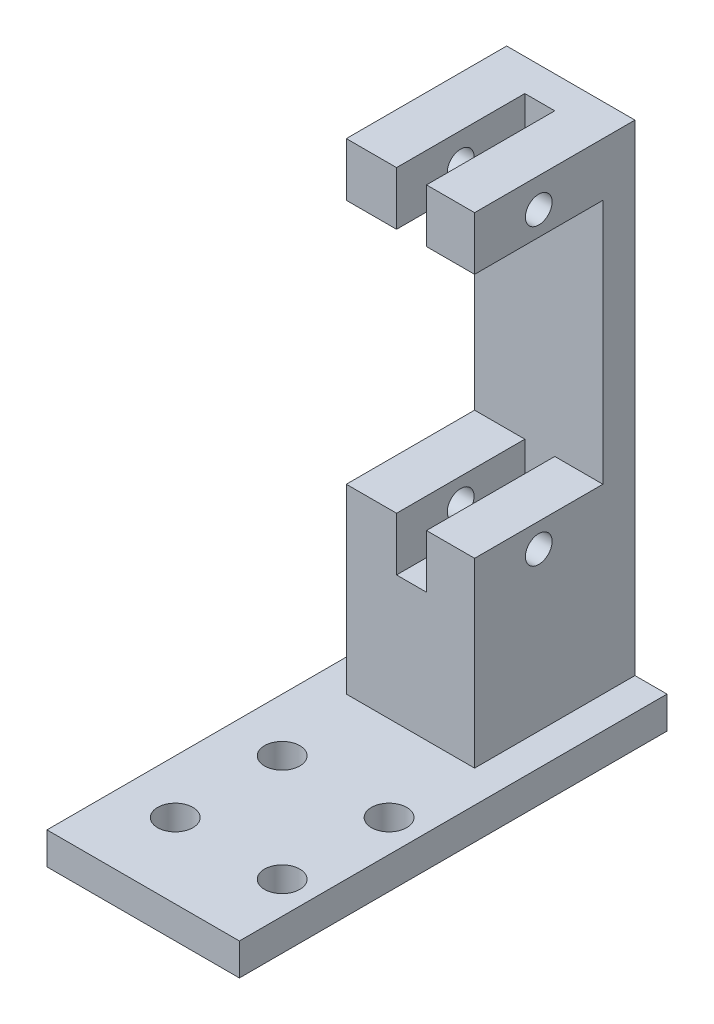
ISO-10303-21;
HEADER;
FILE_DESCRIPTION(('STEP AP214'),'2;1');
FILE_NAME('part.step','',(''),(''),'','','');
FILE_SCHEMA(('AUTOMOTIVE_DESIGN { 1 0 10303 214 1 1 1 1 }'));
ENDSEC;
DATA;
#1=APPLICATION_CONTEXT('core data for automotive mechanical design processes');
#2=APPLICATION_PROTOCOL_DEFINITION('international standard','automotive_design',2000,#1);
#3=PRODUCT_CONTEXT('',#1,'mechanical');
#4=PRODUCT('Part','Part','',(#3));
#5=PRODUCT_RELATED_PRODUCT_CATEGORY('part','',(#4));
#6=PRODUCT_DEFINITION_FORMATION('','',#4);
#7=PRODUCT_DEFINITION_CONTEXT('part definition',#1,'design');
#8=PRODUCT_DEFINITION('design','',#6,#7);
#9=PRODUCT_DEFINITION_SHAPE('','',#8);
#10=(LENGTH_UNIT() NAMED_UNIT(*) SI_UNIT(.MILLI.,.METRE.));
#11=(NAMED_UNIT(*) PLANE_ANGLE_UNIT() SI_UNIT($,.RADIAN.));
#12=(NAMED_UNIT(*) SI_UNIT($,.STERADIAN.) SOLID_ANGLE_UNIT());
#13=UNCERTAINTY_MEASURE_WITH_UNIT(LENGTH_MEASURE(1.E-05),#10,'distance_accuracy_value','');
#14=(GEOMETRIC_REPRESENTATION_CONTEXT(3) GLOBAL_UNCERTAINTY_ASSIGNED_CONTEXT((#13)) GLOBAL_UNIT_ASSIGNED_CONTEXT((#10,
#11,#12)) REPRESENTATION_CONTEXT('',''));
#15=CARTESIAN_POINT('',(0.,0.,0.));
#16=DIRECTION('',(0.,0.,1.));
#17=DIRECTION('',(1.,0.,0.));
#18=AXIS2_PLACEMENT_3D('',#15,#16,#17);
#19=CARTESIAN_POINT('',(-6.00000000000001,20.,3.));
#20=DIRECTION('',(1.,0.,0.));
#21=DIRECTION('',(0.,1.,0.));
#22=AXIS2_PLACEMENT_3D('',#19,#20,#21);
#23=PLANE('',#22);
#24=CARTESIAN_POINT('',(-6.,-10.25,9.));
#25=DIRECTION('',(1.,0.,0.));
#26=DIRECTION('',(0.,1.,0.));
#27=AXIS2_PLACEMENT_3D('',#24,#25,#26);
#28=CIRCLE('',#27,1.25);
#29=CARTESIAN_POINT('',(-6.,-9.00000000000001,9.));
#30=VERTEX_POINT('',#29);
#31=EDGE_CURVE('E255',#30,#30,#28,.T.);
#32=ORIENTED_EDGE('',*,*,#31,.T.);
#33=EDGE_LOOP('',(#32));
#34=FACE_BOUND('',#33,.T.);
#35=CARTESIAN_POINT('',(-6.,17.25,9.));
#36=DIRECTION('',(1.,0.,0.));
#37=DIRECTION('',(0.,1.,0.));
#38=AXIS2_PLACEMENT_3D('',#35,#36,#37);
#39=CIRCLE('',#38,1.25);
#40=CARTESIAN_POINT('',(-6.,18.5,9.));
#41=VERTEX_POINT('',#40);
#42=EDGE_CURVE('E248',#41,#41,#39,.T.);
#43=ORIENTED_EDGE('',*,*,#42,.T.);
#44=EDGE_LOOP('',(#43));
#45=FACE_BOUND('',#44,.T.);
#46=DIRECTION('',(0.,0.,-1.));
#47=VECTOR('',#46,1.);
#48=CARTESIAN_POINT('',(-6.,-25.,40.));
#49=LINE('',#48,#47);
#50=CARTESIAN_POINT('',(-6.00000000000001,-25.,15.));
#51=VERTEX_POINT('',#50);
#52=CARTESIAN_POINT('',(-6.,-25.,0.));
#53=VERTEX_POINT('',#52);
#54=EDGE_CURVE('E11',#51,#53,#49,.T.);
#55=ORIENTED_EDGE('',*,*,#54,.F.);
#56=DIRECTION('',(0.,-1.,0.));
#57=VECTOR('',#56,1.);
#58=CARTESIAN_POINT('',(-6.00000000000001,-8.00000000000001,15.));
#59=LINE('',#58,#57);
#60=CARTESIAN_POINT('',(-6.00000000000001,-8.00000000000001,15.));
#61=VERTEX_POINT('',#60);
#62=EDGE_CURVE('E273',#61,#51,#59,.T.);
#63=ORIENTED_EDGE('',*,*,#62,.F.);
#64=DIRECTION('',(0.,0.,-1.));
#65=VECTOR('',#64,1.);
#66=CARTESIAN_POINT('',(-6.00000000000001,-8.00000000000001,15.));
#67=LINE('',#66,#65);
#68=CARTESIAN_POINT('',(-6.,-8.00000000000001,3.));
#69=VERTEX_POINT('',#68);
#70=EDGE_CURVE('E304',#61,#69,#67,.T.);
#71=ORIENTED_EDGE('',*,*,#70,.T.);
#72=DIRECTION('',(0.,-1.,0.));
#73=VECTOR('',#72,1.);
#74=CARTESIAN_POINT('',(-6.00000000000001,20.,3.));
#75=LINE('',#74,#73);
#76=CARTESIAN_POINT('',(-6.00000000000001,15.,3.));
#77=VERTEX_POINT('',#76);
#78=EDGE_CURVE('E365',#77,#69,#75,.T.);
#79=ORIENTED_EDGE('',*,*,#78,.F.);
#80=DIRECTION('',(0.,0.,-1.));
#81=VECTOR('',#80,1.);
#82=CARTESIAN_POINT('',(-6.00000000000001,15.,15.));
#83=LINE('',#82,#81);
#84=CARTESIAN_POINT('',(-6.00000000000001,15.,15.));
#85=VERTEX_POINT('',#84);
#86=EDGE_CURVE('E331',#85,#77,#83,.T.);
#87=ORIENTED_EDGE('',*,*,#86,.F.);
#88=DIRECTION('',(0.,-1.,0.));
#89=VECTOR('',#88,1.);
#90=CARTESIAN_POINT('',(-6.00000000000001,20.,15.));
#91=LINE('',#90,#89);
#92=CARTESIAN_POINT('',(-6.00000000000001,20.,15.));
#93=VERTEX_POINT('',#92);
#94=EDGE_CURVE('E310',#93,#85,#91,.T.);
#95=ORIENTED_EDGE('',*,*,#94,.F.);
#96=DIRECTION('',(0.,0.,-1.));
#97=VECTOR('',#96,1.);
#98=CARTESIAN_POINT('',(-6.00000000000001,20.,3.));
#99=LINE('',#98,#97);
#100=CARTESIAN_POINT('',(-6.00000000000001,20.,0.));
#101=VERTEX_POINT('',#100);
#102=EDGE_CURVE('E367',#93,#101,#99,.T.);
#103=ORIENTED_EDGE('',*,*,#102,.T.);
#104=DIRECTION('',(0.,-1.,0.));
#105=VECTOR('',#104,1.);
#106=CARTESIAN_POINT('',(-6.00000000000001,20.,0.));
#107=LINE('',#106,#105);
#108=EDGE_CURVE('E363',#101,#53,#107,.T.);
#109=ORIENTED_EDGE('',*,*,#108,.T.);
#110=EDGE_LOOP('',(#55,#63,#71,#79,#87,#95,#103,#109));
#111=FACE_BOUND('',#110,.T.);
#112=ADVANCED_FACE('F36',(#34,#45,#111),#23,.F.);
#113=CARTESIAN_POINT('',(0.,0.,15.));
#114=DIRECTION('',(0.,0.,-1.));
#115=DIRECTION('',(-1.,0.,0.));
#116=AXIS2_PLACEMENT_3D('',#113,#114,#115);
#117=PLANE('',#116);
#118=DIRECTION('',(-1.,0.,0.));
#119=VECTOR('',#118,1.);
#120=CARTESIAN_POINT('',(-6.00000000000001,-25.,15.));
#121=LINE('',#120,#119);
#122=CARTESIAN_POINT('',(6.,-25.,15.));
#123=VERTEX_POINT('',#122);
#124=EDGE_CURVE('E243',#123,#51,#121,.T.);
#125=ORIENTED_EDGE('',*,*,#124,.F.);
#126=DIRECTION('',(0.,1.,0.));
#127=VECTOR('',#126,1.);
#128=CARTESIAN_POINT('',(5.99999999999999,-8.,15.));
#129=LINE('',#128,#127);
#130=CARTESIAN_POINT('',(5.99999999999999,-8.,15.));
#131=VERTEX_POINT('',#130);
#132=EDGE_CURVE('E276',#123,#131,#129,.T.);
#133=ORIENTED_EDGE('',*,*,#132,.T.);
#134=DIRECTION('',(-1.,0.,0.));
#135=VECTOR('',#134,1.);
#136=CARTESIAN_POINT('',(5.99999999999999,-8.,15.));
#137=LINE('',#136,#135);
#138=CARTESIAN_POINT('',(1.5,-8.00000000000001,15.));
#139=VERTEX_POINT('',#138);
#140=EDGE_CURVE('E278',#131,#139,#137,.T.);
#141=ORIENTED_EDGE('',*,*,#140,.T.);
#142=DIRECTION('',(0.,-1.,0.));
#143=VECTOR('',#142,1.);
#144=CARTESIAN_POINT('',(1.5,-13.,15.));
#145=LINE('',#144,#143);
#146=CARTESIAN_POINT('',(1.5,-13.,15.));
#147=VERTEX_POINT('',#146);
#148=EDGE_CURVE('E280',#139,#147,#145,.T.);
#149=ORIENTED_EDGE('',*,*,#148,.T.);
#150=DIRECTION('',(-1.,0.,0.));
#151=VECTOR('',#150,1.);
#152=CARTESIAN_POINT('',(-1.3,-13.,15.));
#153=LINE('',#152,#151);
#154=CARTESIAN_POINT('',(-1.3,-13.,15.));
#155=VERTEX_POINT('',#154);
#156=EDGE_CURVE('E282',#147,#155,#153,.T.);
#157=ORIENTED_EDGE('',*,*,#156,.T.);
#158=DIRECTION('',(0.,1.,0.));
#159=VECTOR('',#158,1.);
#160=CARTESIAN_POINT('',(-1.3,-13.,15.));
#161=LINE('',#160,#159);
#162=CARTESIAN_POINT('',(-1.3,-8.00000000000001,15.));
#163=VERTEX_POINT('',#162);
#164=EDGE_CURVE('E267',#155,#163,#161,.T.);
#165=ORIENTED_EDGE('',*,*,#164,.T.);
#166=DIRECTION('',(-1.,0.,0.));
#167=VECTOR('',#166,1.);
#168=CARTESIAN_POINT('',(-6.00000000000001,-8.00000000000001,15.));
#169=LINE('',#168,#167);
#170=EDGE_CURVE('E270',#163,#61,#169,.T.);
#171=ORIENTED_EDGE('',*,*,#170,.T.);
#172=ORIENTED_EDGE('',*,*,#62,.T.);
#173=EDGE_LOOP('',(#125,#133,#141,#149,#157,#165,#171,#172));
#174=FACE_BOUND('',#173,.T.);
#175=ADVANCED_FACE('F398',(#174),#117,.F.);
#176=CARTESIAN_POINT('',(0.,0.,3.));
#177=DIRECTION('',(0.,0.,-1.));
#178=DIRECTION('',(-1.,0.,0.));
#179=AXIS2_PLACEMENT_3D('',#176,#177,#178);
#180=PLANE('',#179);
#181=DIRECTION('',(-1.,0.,0.));
#182=VECTOR('',#181,1.);
#183=CARTESIAN_POINT('',(-6.00000000000001,-8.00000000000001,3.));
#184=LINE('',#183,#182);
#185=CARTESIAN_POINT('',(-1.3,-8.00000000000001,3.));
#186=VERTEX_POINT('',#185);
#187=EDGE_CURVE('E53',#186,#69,#184,.T.);
#188=ORIENTED_EDGE('',*,*,#187,.F.);
#189=DIRECTION('',(0.,1.,0.));
#190=VECTOR('',#189,1.);
#191=CARTESIAN_POINT('',(-1.3,-13.,3.));
#192=LINE('',#191,#190);
#193=CARTESIAN_POINT('',(-1.3,-13.,3.));
#194=VERTEX_POINT('',#193);
#195=EDGE_CURVE('E266',#194,#186,#192,.T.);
#196=ORIENTED_EDGE('',*,*,#195,.F.);
#197=DIRECTION('',(-1.,0.,0.));
#198=VECTOR('',#197,1.);
#199=CARTESIAN_POINT('',(-1.3,-13.,3.));
#200=LINE('',#199,#198);
#201=CARTESIAN_POINT('',(1.5,-13.,3.));
#202=VERTEX_POINT('',#201);
#203=EDGE_CURVE('E271',#202,#194,#200,.T.);
#204=ORIENTED_EDGE('',*,*,#203,.F.);
#205=DIRECTION('',(0.,-1.,0.));
#206=VECTOR('',#205,1.);
#207=CARTESIAN_POINT('',(1.5,-13.,3.));
#208=LINE('',#207,#206);
#209=CARTESIAN_POINT('',(1.5,-8.00000000000001,3.));
#210=VERTEX_POINT('',#209);
#211=EDGE_CURVE('E60',#210,#202,#208,.T.);
#212=ORIENTED_EDGE('',*,*,#211,.F.);
#213=DIRECTION('',(-1.,0.,0.));
#214=VECTOR('',#213,1.);
#215=CARTESIAN_POINT('',(5.99999999999999,-8.,3.));
#216=LINE('',#215,#214);
#217=CARTESIAN_POINT('',(6.,-8.00000000000001,3.));
#218=VERTEX_POINT('',#217);
#219=EDGE_CURVE('E288',#218,#210,#216,.T.);
#220=ORIENTED_EDGE('',*,*,#219,.F.);
#221=DIRECTION('',(0.,-1.,0.));
#222=VECTOR('',#221,1.);
#223=CARTESIAN_POINT('',(5.99999999999999,20.,3.));
#224=LINE('',#223,#222);
#225=CARTESIAN_POINT('',(6.,15.,3.));
#226=VERTEX_POINT('',#225);
#227=EDGE_CURVE('E359',#226,#218,#224,.T.);
#228=ORIENTED_EDGE('',*,*,#227,.F.);
#229=DIRECTION('',(1.,0.,0.));
#230=VECTOR('',#229,1.);
#231=CARTESIAN_POINT('',(1.5,15.,3.));
#232=LINE('',#231,#230);
#233=CARTESIAN_POINT('',(1.5,15.,3.));
#234=VERTEX_POINT('',#233);
#235=EDGE_CURVE('E339',#234,#226,#232,.T.);
#236=ORIENTED_EDGE('',*,*,#235,.F.);
#237=DIRECTION('',(0.,-1.,0.));
#238=VECTOR('',#237,1.);
#239=CARTESIAN_POINT('',(1.5,20.,3.));
#240=LINE('',#239,#238);
#241=CARTESIAN_POINT('',(1.5,20.,3.));
#242=VERTEX_POINT('',#241);
#243=EDGE_CURVE('E334',#242,#234,#240,.T.);
#244=ORIENTED_EDGE('',*,*,#243,.F.);
#245=DIRECTION('',(1.,0.,0.));
#246=VECTOR('',#245,1.);
#247=CARTESIAN_POINT('',(-6.00000000000001,20.,3.));
#248=LINE('',#247,#246);
#249=CARTESIAN_POINT('',(-1.30000000000001,20.,3.));
#250=VERTEX_POINT('',#249);
#251=EDGE_CURVE('E362',#250,#242,#248,.T.);
#252=ORIENTED_EDGE('',*,*,#251,.F.);
#253=DIRECTION('',(0.,1.,0.));
#254=VECTOR('',#253,1.);
#255=CARTESIAN_POINT('',(-1.30000000000001,20.,3.));
#256=LINE('',#255,#254);
#257=CARTESIAN_POINT('',(-1.30000000000001,15.,3.));
#258=VERTEX_POINT('',#257);
#259=EDGE_CURVE('E314',#258,#250,#256,.T.);
#260=ORIENTED_EDGE('',*,*,#259,.F.);
#261=DIRECTION('',(1.,0.,0.));
#262=VECTOR('',#261,1.);
#263=CARTESIAN_POINT('',(-6.00000000000001,15.,3.));
#264=LINE('',#263,#262);
#265=EDGE_CURVE('E309',#77,#258,#264,.T.);
#266=ORIENTED_EDGE('',*,*,#265,.F.);
#267=ORIENTED_EDGE('',*,*,#78,.T.);
#268=EDGE_LOOP('',(#188,#196,#204,#212,#220,#228,#236,#244,#252,#260,#266,#267));
#269=FACE_BOUND('',#268,.T.);
#270=ADVANCED_FACE('F404',(#269),#180,.F.);
#271=CARTESIAN_POINT('',(5.99999999999999,20.,3.));
#272=DIRECTION('',(1.,0.,0.));
#273=DIRECTION('',(0.,1.,0.));
#274=AXIS2_PLACEMENT_3D('',#271,#272,#273);
#275=PLANE('',#274);
#276=DIRECTION('',(0.,0.,1.));
#277=VECTOR('',#276,1.);
#278=CARTESIAN_POINT('',(6.,-25.,40.));
#279=LINE('',#278,#277);
#280=CARTESIAN_POINT('',(6.,-25.,0.));
#281=VERTEX_POINT('',#280);
#282=EDGE_CURVE('E229',#281,#123,#279,.T.);
#283=ORIENTED_EDGE('',*,*,#282,.F.);
#284=DIRECTION('',(0.,-1.,0.));
#285=VECTOR('',#284,1.);
#286=CARTESIAN_POINT('',(5.99999999999999,20.,0.));
#287=LINE('',#286,#285);
#288=CARTESIAN_POINT('',(5.99999999999999,20.,0.));
#289=VERTEX_POINT('',#288);
#290=EDGE_CURVE('E358',#289,#281,#287,.T.);
#291=ORIENTED_EDGE('',*,*,#290,.F.);
#292=DIRECTION('',(0.,0.,-1.));
#293=VECTOR('',#292,1.);
#294=CARTESIAN_POINT('',(5.99999999999999,20.,3.));
#295=LINE('',#294,#293);
#296=CARTESIAN_POINT('',(5.99999999999999,20.,15.));
#297=VERTEX_POINT('',#296);
#298=EDGE_CURVE('E45',#297,#289,#295,.T.);
#299=ORIENTED_EDGE('',*,*,#298,.F.);
#300=DIRECTION('',(0.,1.,0.));
#301=VECTOR('',#300,1.);
#302=CARTESIAN_POINT('',(5.99999999999999,20.,15.));
#303=LINE('',#302,#301);
#304=CARTESIAN_POINT('',(5.99999999999999,15.,15.));
#305=VERTEX_POINT('',#304);
#306=EDGE_CURVE('E335',#305,#297,#303,.T.);
#307=ORIENTED_EDGE('',*,*,#306,.F.);
#308=DIRECTION('',(0.,0.,-1.));
#309=VECTOR('',#308,1.);
#310=CARTESIAN_POINT('',(5.99999999999999,15.,15.));
#311=LINE('',#310,#309);
#312=EDGE_CURVE('E345',#305,#226,#311,.T.);
#313=ORIENTED_EDGE('',*,*,#312,.T.);
#314=ORIENTED_EDGE('',*,*,#227,.T.);
#315=DIRECTION('',(0.,0.,-1.));
#316=VECTOR('',#315,1.);
#317=CARTESIAN_POINT('',(5.99999999999999,-8.,15.));
#318=LINE('',#317,#316);
#319=EDGE_CURVE('E301',#131,#218,#318,.T.);
#320=ORIENTED_EDGE('',*,*,#319,.F.);
#321=ORIENTED_EDGE('',*,*,#132,.F.);
#322=EDGE_LOOP('',(#283,#291,#299,#307,#313,#314,#320,#321));
#323=FACE_BOUND('',#322,.T.);
#324=CARTESIAN_POINT('',(6.,17.25,9.));
#325=DIRECTION('',(1.,0.,0.));
#326=DIRECTION('',(0.,1.,0.));
#327=AXIS2_PLACEMENT_3D('',#324,#325,#326);
#328=CIRCLE('',#327,1.25);
#329=CARTESIAN_POINT('',(6.,18.5,9.));
#330=VERTEX_POINT('',#329);
#331=EDGE_CURVE('E252',#330,#330,#328,.T.);
#332=ORIENTED_EDGE('',*,*,#331,.F.);
#333=EDGE_LOOP('',(#332));
#334=FACE_BOUND('',#333,.T.);
#335=CARTESIAN_POINT('',(6.,-10.25,9.));
#336=DIRECTION('',(1.,0.,0.));
#337=DIRECTION('',(0.,1.,0.));
#338=AXIS2_PLACEMENT_3D('',#335,#336,#337);
#339=CIRCLE('',#338,1.25);
#340=CARTESIAN_POINT('',(6.,-9.00000000000001,9.));
#341=VERTEX_POINT('',#340);
#342=EDGE_CURVE('E247',#341,#341,#339,.T.);
#343=ORIENTED_EDGE('',*,*,#342,.F.);
#344=EDGE_LOOP('',(#343));
#345=FACE_BOUND('',#344,.T.);
#346=ADVANCED_FACE('F38',(#323,#334,#345),#275,.T.);
#347=CARTESIAN_POINT('',(-6.00000000000001,20.,3.));
#348=DIRECTION('',(0.,1.,0.));
#349=DIRECTION('',(0.,0.,1.));
#350=AXIS2_PLACEMENT_3D('',#347,#348,#349);
#351=PLANE('',#350);
#352=DIRECTION('',(1.,0.,0.));
#353=VECTOR('',#352,1.);
#354=CARTESIAN_POINT('',(-6.00000000000001,20.,0.));
#355=LINE('',#354,#353);
#356=EDGE_CURVE('E370',#101,#289,#355,.T.);
#357=ORIENTED_EDGE('',*,*,#356,.F.);
#358=ORIENTED_EDGE('',*,*,#102,.F.);
#359=DIRECTION('',(-1.,0.,0.));
#360=VECTOR('',#359,1.);
#361=CARTESIAN_POINT('',(-6.00000000000001,20.,15.));
#362=LINE('',#361,#360);
#363=CARTESIAN_POINT('',(-1.30000000000001,20.,15.));
#364=VERTEX_POINT('',#363);
#365=EDGE_CURVE('E318',#364,#93,#362,.T.);
#366=ORIENTED_EDGE('',*,*,#365,.F.);
#367=DIRECTION('',(0.,0.,-1.));
#368=VECTOR('',#367,1.);
#369=CARTESIAN_POINT('',(-1.30000000000001,20.,15.));
#370=LINE('',#369,#368);
#371=EDGE_CURVE('E321',#364,#250,#370,.T.);
#372=ORIENTED_EDGE('',*,*,#371,.T.);
#373=ORIENTED_EDGE('',*,*,#251,.T.);
#374=DIRECTION('',(0.,0.,-1.));
#375=VECTOR('',#374,1.);
#376=CARTESIAN_POINT('',(1.5,20.,15.));
#377=LINE('',#376,#375);
#378=CARTESIAN_POINT('',(1.5,20.,15.));
#379=VERTEX_POINT('',#378);
#380=EDGE_CURVE('E355',#379,#242,#377,.T.);
#381=ORIENTED_EDGE('',*,*,#380,.F.);
#382=DIRECTION('',(-1.,0.,0.));
#383=VECTOR('',#382,1.);
#384=CARTESIAN_POINT('',(1.5,20.,15.));
#385=LINE('',#384,#383);
#386=EDGE_CURVE('E338',#297,#379,#385,.T.);
#387=ORIENTED_EDGE('',*,*,#386,.F.);
#388=ORIENTED_EDGE('',*,*,#298,.T.);
#389=EDGE_LOOP('',(#357,#358,#366,#372,#373,#381,#387,#388));
#390=FACE_BOUND('',#389,.T.);
#391=ADVANCED_FACE('F410',(#390),#351,.T.);
#392=CARTESIAN_POINT('',(0.,0.,0.));
#393=DIRECTION('',(0.,0.,-1.));
#394=DIRECTION('',(-1.,0.,0.));
#395=AXIS2_PLACEMENT_3D('',#392,#393,#394);
#396=PLANE('',#395);
#397=ORIENTED_EDGE('',*,*,#290,.T.);
#398=DIRECTION('',(-1.,0.,0.));
#399=VECTOR('',#398,1.);
#400=CARTESIAN_POINT('',(9.,-25.,0.));
#401=LINE('',#400,#399);
#402=CARTESIAN_POINT('',(9.,-25.,0.));
#403=VERTEX_POINT('',#402);
#404=EDGE_CURVE('E240',#403,#281,#401,.T.);
#405=ORIENTED_EDGE('',*,*,#404,.F.);
#406=DIRECTION('',(0.,1.,0.));
#407=VECTOR('',#406,1.);
#408=CARTESIAN_POINT('',(9.,-25.,0.));
#409=LINE('',#408,#407);
#410=CARTESIAN_POINT('',(9.00000000000001,-28.,0.));
#411=VERTEX_POINT('',#410);
#412=EDGE_CURVE('E236',#411,#403,#409,.T.);
#413=ORIENTED_EDGE('',*,*,#412,.F.);
#414=DIRECTION('',(1.,0.,0.));
#415=VECTOR('',#414,1.);
#416=CARTESIAN_POINT('',(-6.,-28.,0.));
#417=LINE('',#416,#415);
#418=CARTESIAN_POINT('',(-9.,-28.,0.));
#419=VERTEX_POINT('',#418);
#420=EDGE_CURVE('E184',#419,#411,#417,.T.);
#421=ORIENTED_EDGE('',*,*,#420,.F.);
#422=DIRECTION('',(0.,-1.,0.));
#423=VECTOR('',#422,1.);
#424=CARTESIAN_POINT('',(-9.,-25.,0.));
#425=LINE('',#424,#423);
#426=CARTESIAN_POINT('',(-9.,-25.,0.));
#427=VERTEX_POINT('',#426);
#428=EDGE_CURVE('E196',#427,#419,#425,.T.);
#429=ORIENTED_EDGE('',*,*,#428,.F.);
#430=DIRECTION('',(1.,0.,0.));
#431=VECTOR('',#430,1.);
#432=CARTESIAN_POINT('',(-9.,-25.,0.));
#433=LINE('',#432,#431);
#434=EDGE_CURVE('E192',#427,#53,#433,.T.);
#435=ORIENTED_EDGE('',*,*,#434,.T.);
#436=ORIENTED_EDGE('',*,*,#108,.F.);
#437=ORIENTED_EDGE('',*,*,#356,.T.);
#438=EDGE_LOOP('',(#397,#405,#413,#421,#429,#435,#436,#437));
#439=FACE_BOUND('',#438,.T.);
#440=ADVANCED_FACE('F408',(#439),#396,.T.);
#441=CARTESIAN_POINT('',(1.5,20.,15.));
#442=DIRECTION('',(1.,0.,0.));
#443=DIRECTION('',(0.,1.,0.));
#444=AXIS2_PLACEMENT_3D('',#441,#442,#443);
#445=PLANE('',#444);
#446=CARTESIAN_POINT('',(1.5,17.25,9.));
#447=DIRECTION('',(1.,0.,0.));
#448=DIRECTION('',(0.,1.,0.));
#449=AXIS2_PLACEMENT_3D('',#446,#447,#448);
#450=CIRCLE('',#449,1.25);
#451=CARTESIAN_POINT('',(1.5,18.5,9.));
#452=VERTEX_POINT('',#451);
#453=EDGE_CURVE('E263',#452,#452,#450,.T.);
#454=ORIENTED_EDGE('',*,*,#453,.T.);
#455=EDGE_LOOP('',(#454));
#456=FACE_BOUND('',#455,.T.);
#457=ORIENTED_EDGE('',*,*,#243,.T.);
#458=DIRECTION('',(0.,0.,-1.));
#459=VECTOR('',#458,1.);
#460=CARTESIAN_POINT('',(1.5,15.,15.));
#461=LINE('',#460,#459);
#462=CARTESIAN_POINT('',(1.5,15.,15.));
#463=VERTEX_POINT('',#462);
#464=EDGE_CURVE('E352',#463,#234,#461,.T.);
#465=ORIENTED_EDGE('',*,*,#464,.F.);
#466=DIRECTION('',(0.,-1.,0.));
#467=VECTOR('',#466,1.);
#468=CARTESIAN_POINT('',(1.5,20.,15.));
#469=LINE('',#468,#467);
#470=EDGE_CURVE('E341',#379,#463,#469,.T.);
#471=ORIENTED_EDGE('',*,*,#470,.F.);
#472=ORIENTED_EDGE('',*,*,#380,.T.);
#473=EDGE_LOOP('',(#457,#465,#471,#472));
#474=FACE_BOUND('',#473,.T.);
#475=ADVANCED_FACE('F417',(#456,#474),#445,.F.);
#476=CARTESIAN_POINT('',(1.5,15.,15.));
#477=DIRECTION('',(0.,1.,0.));
#478=DIRECTION('',(0.,0.,1.));
#479=AXIS2_PLACEMENT_3D('',#476,#477,#478);
#480=PLANE('',#479);
#481=ORIENTED_EDGE('',*,*,#235,.T.);
#482=ORIENTED_EDGE('',*,*,#312,.F.);
#483=DIRECTION('',(1.,0.,0.));
#484=VECTOR('',#483,1.);
#485=CARTESIAN_POINT('',(1.5,15.,15.));
#486=LINE('',#485,#484);
#487=EDGE_CURVE('E343',#463,#305,#486,.T.);
#488=ORIENTED_EDGE('',*,*,#487,.F.);
#489=ORIENTED_EDGE('',*,*,#464,.T.);
#490=EDGE_LOOP('',(#481,#482,#488,#489));
#491=FACE_BOUND('',#490,.T.);
#492=ADVANCED_FACE('F455',(#491),#480,.F.);
#493=CARTESIAN_POINT('',(0.,0.,15.));
#494=DIRECTION('',(0.,0.,1.));
#495=DIRECTION('',(1.,0.,0.));
#496=AXIS2_PLACEMENT_3D('',#493,#494,#495);
#497=PLANE('',#496);
#498=ORIENTED_EDGE('',*,*,#306,.T.);
#499=ORIENTED_EDGE('',*,*,#386,.T.);
#500=ORIENTED_EDGE('',*,*,#470,.T.);
#501=ORIENTED_EDGE('',*,*,#487,.T.);
#502=EDGE_LOOP('',(#498,#499,#500,#501));
#503=FACE_BOUND('',#502,.T.);
#504=ADVANCED_FACE('F484',(#503),#497,.T.);
#505=CARTESIAN_POINT('',(-6.00000000000001,15.,15.));
#506=DIRECTION('',(0.,1.,0.));
#507=DIRECTION('',(-1.,0.,0.));
#508=AXIS2_PLACEMENT_3D('',#505,#506,#507);
#509=PLANE('',#508);
#510=ORIENTED_EDGE('',*,*,#265,.T.);
#511=DIRECTION('',(0.,0.,-1.));
#512=VECTOR('',#511,1.);
#513=CARTESIAN_POINT('',(-1.30000000000001,15.,15.));
#514=LINE('',#513,#512);
#515=CARTESIAN_POINT('',(-1.30000000000001,15.,15.));
#516=VERTEX_POINT('',#515);
#517=EDGE_CURVE('E328',#516,#258,#514,.T.);
#518=ORIENTED_EDGE('',*,*,#517,.F.);
#519=DIRECTION('',(1.,0.,0.));
#520=VECTOR('',#519,1.);
#521=CARTESIAN_POINT('',(-6.00000000000001,15.,15.));
#522=LINE('',#521,#520);
#523=EDGE_CURVE('E313',#85,#516,#522,.T.);
#524=ORIENTED_EDGE('',*,*,#523,.F.);
#525=ORIENTED_EDGE('',*,*,#86,.T.);
#526=EDGE_LOOP('',(#510,#518,#524,#525));
#527=FACE_BOUND('',#526,.T.);
#528=ADVANCED_FACE('F467',(#527),#509,.F.);
#529=CARTESIAN_POINT('',(-1.30000000000001,20.,15.));
#530=DIRECTION('',(-1.,0.,0.));
#531=DIRECTION('',(0.,0.,1.));
#532=AXIS2_PLACEMENT_3D('',#529,#530,#531);
#533=PLANE('',#532);
#534=CARTESIAN_POINT('',(-1.30000000000001,17.25,9.));
#535=DIRECTION('',(-1.,0.,0.));
#536=DIRECTION('',(0.,0.,1.));
#537=AXIS2_PLACEMENT_3D('',#534,#535,#536);
#538=CIRCLE('',#537,1.25);
#539=CARTESIAN_POINT('',(-1.30000000000001,17.25,10.25));
#540=VERTEX_POINT('',#539);
#541=EDGE_CURVE('E40',#540,#540,#538,.T.);
#542=ORIENTED_EDGE('',*,*,#541,.T.);
#543=EDGE_LOOP('',(#542));
#544=FACE_BOUND('',#543,.T.);
#545=ORIENTED_EDGE('',*,*,#259,.T.);
#546=ORIENTED_EDGE('',*,*,#371,.F.);
#547=DIRECTION('',(0.,1.,0.));
#548=VECTOR('',#547,1.);
#549=CARTESIAN_POINT('',(-1.30000000000001,20.,15.));
#550=LINE('',#549,#548);
#551=EDGE_CURVE('E316',#516,#364,#550,.T.);
#552=ORIENTED_EDGE('',*,*,#551,.F.);
#553=ORIENTED_EDGE('',*,*,#517,.T.);
#554=EDGE_LOOP('',(#545,#546,#552,#553));
#555=FACE_BOUND('',#554,.T.);
#556=ADVANCED_FACE('F463',(#544,#555),#533,.F.);
#557=CARTESIAN_POINT('',(0.,0.,15.));
#558=DIRECTION('',(0.,0.,1.));
#559=DIRECTION('',(1.,0.,0.));
#560=AXIS2_PLACEMENT_3D('',#557,#558,#559);
#561=PLANE('',#560);
#562=ORIENTED_EDGE('',*,*,#94,.T.);
#563=ORIENTED_EDGE('',*,*,#523,.T.);
#564=ORIENTED_EDGE('',*,*,#551,.T.);
#565=ORIENTED_EDGE('',*,*,#365,.T.);
#566=EDGE_LOOP('',(#562,#563,#564,#565));
#567=FACE_BOUND('',#566,.T.);
#568=ADVANCED_FACE('F469',(#567),#561,.T.);
#569=CARTESIAN_POINT('',(-1.3,-13.,15.));
#570=DIRECTION('',(-1.,0.,0.));
#571=DIRECTION('',(0.,0.,1.));
#572=AXIS2_PLACEMENT_3D('',#569,#570,#571);
#573=PLANE('',#572);
#574=CARTESIAN_POINT('',(-1.3,-10.25,9.));
#575=DIRECTION('',(-1.,0.,0.));
#576=DIRECTION('',(0.,0.,1.));
#577=AXIS2_PLACEMENT_3D('',#574,#575,#576);
#578=CIRCLE('',#577,1.25);
#579=CARTESIAN_POINT('',(-1.3,-10.25,10.25));
#580=VERTEX_POINT('',#579);
#581=EDGE_CURVE('E260',#580,#580,#578,.T.);
#582=ORIENTED_EDGE('',*,*,#581,.T.);
#583=EDGE_LOOP('',(#582));
#584=FACE_BOUND('',#583,.T.);
#585=ORIENTED_EDGE('',*,*,#195,.T.);
#586=DIRECTION('',(0.,0.,-1.));
#587=VECTOR('',#586,1.);
#588=CARTESIAN_POINT('',(-1.3,-8.00000000000001,15.));
#589=LINE('',#588,#587);
#590=EDGE_CURVE('E307',#163,#186,#589,.T.);
#591=ORIENTED_EDGE('',*,*,#590,.F.);
#592=ORIENTED_EDGE('',*,*,#164,.F.);
#593=DIRECTION('',(0.,0.,-1.));
#594=VECTOR('',#593,1.);
#595=CARTESIAN_POINT('',(-1.3,-13.,15.));
#596=LINE('',#595,#594);
#597=EDGE_CURVE('E284',#155,#194,#596,.T.);
#598=ORIENTED_EDGE('',*,*,#597,.T.);
#599=EDGE_LOOP('',(#585,#591,#592,#598));
#600=FACE_BOUND('',#599,.T.);
#601=ADVANCED_FACE('F440',(#584,#600),#573,.F.);
#602=CARTESIAN_POINT('',(-6.00000000000001,-8.00000000000001,15.));
#603=DIRECTION('',(0.,-1.,0.));
#604=DIRECTION('',(0.,0.,-1.));
#605=AXIS2_PLACEMENT_3D('',#602,#603,#604);
#606=PLANE('',#605);
#607=ORIENTED_EDGE('',*,*,#187,.T.);
#608=ORIENTED_EDGE('',*,*,#70,.F.);
#609=ORIENTED_EDGE('',*,*,#170,.F.);
#610=ORIENTED_EDGE('',*,*,#590,.T.);
#611=EDGE_LOOP('',(#607,#608,#609,#610));
#612=FACE_BOUND('',#611,.T.);
#613=ADVANCED_FACE('F436',(#612),#606,.F.);
#614=CARTESIAN_POINT('',(5.99999999999999,-8.,15.));
#615=DIRECTION('',(0.,-1.,0.));
#616=DIRECTION('',(1.,0.,0.));
#617=AXIS2_PLACEMENT_3D('',#614,#615,#616);
#618=PLANE('',#617);
#619=ORIENTED_EDGE('',*,*,#219,.T.);
#620=DIRECTION('',(0.,0.,-1.));
#621=VECTOR('',#620,1.);
#622=CARTESIAN_POINT('',(1.5,-8.00000000000001,15.));
#623=LINE('',#622,#621);
#624=EDGE_CURVE('E298',#139,#210,#623,.T.);
#625=ORIENTED_EDGE('',*,*,#624,.F.);
#626=ORIENTED_EDGE('',*,*,#140,.F.);
#627=ORIENTED_EDGE('',*,*,#319,.T.);
#628=EDGE_LOOP('',(#619,#625,#626,#627));
#629=FACE_BOUND('',#628,.T.);
#630=ADVANCED_FACE('F448',(#629),#618,.F.);
#631=CARTESIAN_POINT('',(1.5,-13.,15.));
#632=DIRECTION('',(1.,0.,0.));
#633=DIRECTION('',(0.,0.,-1.));
#634=AXIS2_PLACEMENT_3D('',#631,#632,#633);
#635=PLANE('',#634);
#636=CARTESIAN_POINT('',(1.5,-10.25,9.));
#637=DIRECTION('',(1.,0.,0.));
#638=DIRECTION('',(0.,0.,-1.));
#639=AXIS2_PLACEMENT_3D('',#636,#637,#638);
#640=CIRCLE('',#639,1.25);
#641=CARTESIAN_POINT('',(1.5,-10.25,7.75));
#642=VERTEX_POINT('',#641);
#643=EDGE_CURVE('E251',#642,#642,#640,.T.);
#644=ORIENTED_EDGE('',*,*,#643,.T.);
#645=EDGE_LOOP('',(#644));
#646=FACE_BOUND('',#645,.T.);
#647=ORIENTED_EDGE('',*,*,#211,.T.);
#648=DIRECTION('',(0.,0.,-1.));
#649=VECTOR('',#648,1.);
#650=CARTESIAN_POINT('',(1.5,-13.,15.));
#651=LINE('',#650,#649);
#652=EDGE_CURVE('E295',#147,#202,#651,.T.);
#653=ORIENTED_EDGE('',*,*,#652,.F.);
#654=ORIENTED_EDGE('',*,*,#148,.F.);
#655=ORIENTED_EDGE('',*,*,#624,.T.);
#656=EDGE_LOOP('',(#647,#653,#654,#655));
#657=FACE_BOUND('',#656,.T.);
#658=ADVANCED_FACE('F378',(#646,#657),#635,.F.);
#659=CARTESIAN_POINT('',(-1.3,-13.,15.));
#660=DIRECTION('',(0.,-1.,0.));
#661=DIRECTION('',(0.,0.,-1.));
#662=AXIS2_PLACEMENT_3D('',#659,#660,#661);
#663=PLANE('',#662);
#664=ORIENTED_EDGE('',*,*,#203,.T.);
#665=ORIENTED_EDGE('',*,*,#597,.F.);
#666=ORIENTED_EDGE('',*,*,#156,.F.);
#667=ORIENTED_EDGE('',*,*,#652,.T.);
#668=EDGE_LOOP('',(#664,#665,#666,#667));
#669=FACE_BOUND('',#668,.T.);
#670=ADVANCED_FACE('F384',(#669),#663,.F.);
#671=CARTESIAN_POINT('',(-6.,-10.25,9.));
#672=DIRECTION('',(1.,0.,0.));
#673=DIRECTION('',(0.,1.,0.));
#674=AXIS2_PLACEMENT_3D('',#671,#672,#673);
#675=CYLINDRICAL_SURFACE('',#674,1.25);
#676=ORIENTED_EDGE('',*,*,#342,.T.);
#677=EDGE_LOOP('',(#676));
#678=FACE_BOUND('',#677,.T.);
#679=ORIENTED_EDGE('',*,*,#643,.F.);
#680=EDGE_LOOP('',(#679));
#681=FACE_BOUND('',#680,.T.);
#682=ADVANCED_FACE('F381',(#678,#681),#675,.F.);
#683=ORIENTED_EDGE('',*,*,#31,.F.);
#684=EDGE_LOOP('',(#683));
#685=FACE_BOUND('',#684,.T.);
#686=ORIENTED_EDGE('',*,*,#581,.F.);
#687=EDGE_LOOP('',(#686));
#688=FACE_BOUND('',#687,.T.);
#689=ADVANCED_FACE('F383',(#685,#688),#675,.F.);
#690=CARTESIAN_POINT('',(-6.,17.25,9.));
#691=DIRECTION('',(1.,0.,0.));
#692=DIRECTION('',(0.,1.,0.));
#693=AXIS2_PLACEMENT_3D('',#690,#691,#692);
#694=CYLINDRICAL_SURFACE('',#693,1.25);
#695=ORIENTED_EDGE('',*,*,#42,.F.);
#696=EDGE_LOOP('',(#695));
#697=FACE_BOUND('',#696,.T.);
#698=ORIENTED_EDGE('',*,*,#541,.F.);
#699=EDGE_LOOP('',(#698));
#700=FACE_BOUND('',#699,.T.);
#701=ADVANCED_FACE('F391',(#697,#700),#694,.F.);
#702=ORIENTED_EDGE('',*,*,#331,.T.);
#703=EDGE_LOOP('',(#702));
#704=FACE_BOUND('',#703,.T.);
#705=ORIENTED_EDGE('',*,*,#453,.F.);
#706=EDGE_LOOP('',(#705));
#707=FACE_BOUND('',#706,.T.);
#708=ADVANCED_FACE('F510',(#704,#707),#694,.F.);
#709=CARTESIAN_POINT('',(0.,-28.,0.));
#710=DIRECTION('',(0.,-1.,0.));
#711=DIRECTION('',(0.,0.,-1.));
#712=AXIS2_PLACEMENT_3D('',#709,#710,#711);
#713=PLANE('',#712);
#714=CARTESIAN_POINT('',(-4.,-28.,23.));
#715=DIRECTION('',(0.,1.,0.));
#716=DIRECTION('',(-1.,0.,0.));
#717=AXIS2_PLACEMENT_3D('',#714,#715,#716);
#718=CIRCLE('',#717,1.65);
#719=CARTESIAN_POINT('',(-5.65,-28.,23.));
#720=VERTEX_POINT('',#719);
#721=EDGE_CURVE('E221',#720,#720,#718,.T.);
#722=ORIENTED_EDGE('',*,*,#721,.T.);
#723=EDGE_LOOP('',(#722));
#724=FACE_BOUND('',#723,.T.);
#725=CARTESIAN_POINT('',(-4.,-28.,33.));
#726=DIRECTION('',(0.,1.,0.));
#727=DIRECTION('',(-1.,0.,0.));
#728=AXIS2_PLACEMENT_3D('',#725,#726,#727);
#729=CIRCLE('',#728,1.65);
#730=CARTESIAN_POINT('',(-5.65,-28.,33.));
#731=VERTEX_POINT('',#730);
#732=EDGE_CURVE('E215',#731,#731,#729,.T.);
#733=ORIENTED_EDGE('',*,*,#732,.T.);
#734=EDGE_LOOP('',(#733));
#735=FACE_BOUND('',#734,.T.);
#736=CARTESIAN_POINT('',(6.,-28.,33.));
#737=DIRECTION('',(0.,1.,0.));
#738=DIRECTION('',(-1.,0.,0.));
#739=AXIS2_PLACEMENT_3D('',#736,#737,#738);
#740=CIRCLE('',#739,1.65);
#741=CARTESIAN_POINT('',(4.35,-28.,33.));
#742=VERTEX_POINT('',#741);
#743=EDGE_CURVE('E208',#742,#742,#740,.T.);
#744=ORIENTED_EDGE('',*,*,#743,.T.);
#745=EDGE_LOOP('',(#744));
#746=FACE_BOUND('',#745,.T.);
#747=CARTESIAN_POINT('',(6.,-28.,23.));
#748=DIRECTION('',(0.,1.,0.));
#749=DIRECTION('',(-1.,0.,0.));
#750=AXIS2_PLACEMENT_3D('',#747,#748,#749);
#751=CIRCLE('',#750,1.65);
#752=CARTESIAN_POINT('',(4.35,-28.,23.));
#753=VERTEX_POINT('',#752);
#754=EDGE_CURVE('E226',#753,#753,#751,.T.);
#755=ORIENTED_EDGE('',*,*,#754,.T.);
#756=EDGE_LOOP('',(#755));
#757=FACE_BOUND('',#756,.T.);
#758=DIRECTION('',(1.,0.,0.));
#759=VECTOR('',#758,1.);
#760=CARTESIAN_POINT('',(-6.,-28.,40.));
#761=LINE('',#760,#759);
#762=CARTESIAN_POINT('',(-9.,-28.,40.));
#763=VERTEX_POINT('',#762);
#764=CARTESIAN_POINT('',(9.00000000000001,-28.,40.));
#765=VERTEX_POINT('',#764);
#766=EDGE_CURVE('E185',#763,#765,#761,.T.);
#767=ORIENTED_EDGE('',*,*,#766,.F.);
#768=DIRECTION('',(0.,0.,1.));
#769=VECTOR('',#768,1.);
#770=CARTESIAN_POINT('',(-9.,-28.,40.));
#771=LINE('',#770,#769);
#772=EDGE_CURVE('E201',#419,#763,#771,.T.);
#773=ORIENTED_EDGE('',*,*,#772,.F.);
#774=ORIENTED_EDGE('',*,*,#420,.T.);
#775=DIRECTION('',(0.,0.,-1.));
#776=VECTOR('',#775,1.);
#777=CARTESIAN_POINT('',(9.00000000000001,-28.,40.));
#778=LINE('',#777,#776);
#779=EDGE_CURVE('E233',#765,#411,#778,.T.);
#780=ORIENTED_EDGE('',*,*,#779,.F.);
#781=EDGE_LOOP('',(#767,#773,#774,#780));
#782=FACE_BOUND('',#781,.T.);
#783=ADVANCED_FACE('F586',(#724,#735,#746,#757,#782),#713,.T.);
#784=CARTESIAN_POINT('',(-6.00000000000001,-25.,40.));
#785=DIRECTION('',(0.,-1.,0.));
#786=DIRECTION('',(1.,0.,0.));
#787=AXIS2_PLACEMENT_3D('',#784,#785,#786);
#788=PLANE('',#787);
#789=CARTESIAN_POINT('',(-4.,-25.,23.));
#790=DIRECTION('',(0.,1.,0.));
#791=DIRECTION('',(-1.,0.,0.));
#792=AXIS2_PLACEMENT_3D('',#789,#790,#791);
#793=CIRCLE('',#792,1.65);
#794=CARTESIAN_POINT('',(-5.65,-25.,23.));
#795=VERTEX_POINT('',#794);
#796=EDGE_CURVE('E207',#795,#795,#793,.T.);
#797=ORIENTED_EDGE('',*,*,#796,.F.);
#798=EDGE_LOOP('',(#797));
#799=FACE_BOUND('',#798,.T.);
#800=CARTESIAN_POINT('',(-4.,-25.,33.));
#801=DIRECTION('',(0.,1.,0.));
#802=DIRECTION('',(-1.,0.,0.));
#803=AXIS2_PLACEMENT_3D('',#800,#801,#802);
#804=CIRCLE('',#803,1.65);
#805=CARTESIAN_POINT('',(-5.65,-25.,33.));
#806=VERTEX_POINT('',#805);
#807=EDGE_CURVE('E218',#806,#806,#804,.T.);
#808=ORIENTED_EDGE('',*,*,#807,.F.);
#809=EDGE_LOOP('',(#808));
#810=FACE_BOUND('',#809,.T.);
#811=CARTESIAN_POINT('',(6.,-25.,33.));
#812=DIRECTION('',(0.,1.,0.));
#813=DIRECTION('',(-1.,0.,0.));
#814=AXIS2_PLACEMENT_3D('',#811,#812,#813);
#815=CIRCLE('',#814,1.65);
#816=CARTESIAN_POINT('',(4.35,-25.,33.));
#817=VERTEX_POINT('',#816);
#818=EDGE_CURVE('E212',#817,#817,#815,.T.);
#819=ORIENTED_EDGE('',*,*,#818,.F.);
#820=EDGE_LOOP('',(#819));
#821=FACE_BOUND('',#820,.T.);
#822=CARTESIAN_POINT('',(6.,-25.,23.));
#823=DIRECTION('',(0.,1.,0.));
#824=DIRECTION('',(-1.,0.,0.));
#825=AXIS2_PLACEMENT_3D('',#822,#823,#824);
#826=CIRCLE('',#825,1.65);
#827=CARTESIAN_POINT('',(4.35,-25.,23.));
#828=VERTEX_POINT('',#827);
#829=EDGE_CURVE('E211',#828,#828,#826,.T.);
#830=ORIENTED_EDGE('',*,*,#829,.F.);
#831=EDGE_LOOP('',(#830));
#832=FACE_BOUND('',#831,.T.);
#833=ORIENTED_EDGE('',*,*,#124,.T.);
#834=ORIENTED_EDGE('',*,*,#54,.T.);
#835=ORIENTED_EDGE('',*,*,#434,.F.);
#836=DIRECTION('',(0.,0.,-1.));
#837=VECTOR('',#836,1.);
#838=CARTESIAN_POINT('',(-9.,-25.,40.));
#839=LINE('',#838,#837);
#840=CARTESIAN_POINT('',(-9.,-25.,40.));
#841=VERTEX_POINT('',#840);
#842=EDGE_CURVE('E188',#841,#427,#839,.T.);
#843=ORIENTED_EDGE('',*,*,#842,.F.);
#844=DIRECTION('',(-1.,0.,0.));
#845=VECTOR('',#844,1.);
#846=CARTESIAN_POINT('',(-6.00000000000001,-25.,40.));
#847=LINE('',#846,#845);
#848=CARTESIAN_POINT('',(9.,-25.,40.));
#849=VERTEX_POINT('',#848);
#850=EDGE_CURVE('E174',#849,#841,#847,.T.);
#851=ORIENTED_EDGE('',*,*,#850,.F.);
#852=DIRECTION('',(0.,0.,1.));
#853=VECTOR('',#852,1.);
#854=CARTESIAN_POINT('',(9.,-25.,40.));
#855=LINE('',#854,#853);
#856=EDGE_CURVE('E238',#403,#849,#855,.T.);
#857=ORIENTED_EDGE('',*,*,#856,.F.);
#858=ORIENTED_EDGE('',*,*,#404,.T.);
#859=ORIENTED_EDGE('',*,*,#282,.T.);
#860=EDGE_LOOP('',(#833,#834,#835,#843,#851,#857,#858,#859));
#861=FACE_BOUND('',#860,.T.);
#862=ADVANCED_FACE('F190',(#799,#810,#821,#832,#861),#788,.F.);
#863=CARTESIAN_POINT('',(0.,0.,40.));
#864=DIRECTION('',(0.,0.,1.));
#865=DIRECTION('',(1.,0.,0.));
#866=AXIS2_PLACEMENT_3D('',#863,#864,#865);
#867=PLANE('',#866);
#868=ORIENTED_EDGE('',*,*,#850,.T.);
#869=DIRECTION('',(0.,1.,0.));
#870=VECTOR('',#869,1.);
#871=CARTESIAN_POINT('',(-9.,-25.,40.));
#872=LINE('',#871,#870);
#873=EDGE_CURVE('E178',#763,#841,#872,.T.);
#874=ORIENTED_EDGE('',*,*,#873,.F.);
#875=ORIENTED_EDGE('',*,*,#766,.T.);
#876=DIRECTION('',(0.,-1.,0.));
#877=VECTOR('',#876,1.);
#878=CARTESIAN_POINT('',(9.,-25.,40.));
#879=LINE('',#878,#877);
#880=EDGE_CURVE('E180',#849,#765,#879,.T.);
#881=ORIENTED_EDGE('',*,*,#880,.F.);
#882=EDGE_LOOP('',(#868,#874,#875,#881));
#883=FACE_BOUND('',#882,.T.);
#884=ADVANCED_FACE('F176',(#883),#867,.T.);
#885=CARTESIAN_POINT('',(9.,0.,0.));
#886=DIRECTION('',(1.,0.,0.));
#887=DIRECTION('',(0.,1.,0.));
#888=AXIS2_PLACEMENT_3D('',#885,#886,#887);
#889=PLANE('',#888);
#890=ORIENTED_EDGE('',*,*,#880,.T.);
#891=ORIENTED_EDGE('',*,*,#779,.T.);
#892=ORIENTED_EDGE('',*,*,#412,.T.);
#893=ORIENTED_EDGE('',*,*,#856,.T.);
#894=EDGE_LOOP('',(#890,#891,#892,#893));
#895=FACE_BOUND('',#894,.T.);
#896=ADVANCED_FACE('F515',(#895),#889,.T.);
#897=CARTESIAN_POINT('',(6.,-28.,23.));
#898=DIRECTION('',(0.,1.,0.));
#899=DIRECTION('',(-1.,0.,0.));
#900=AXIS2_PLACEMENT_3D('',#897,#898,#899);
#901=CYLINDRICAL_SURFACE('',#900,1.65);
#902=ORIENTED_EDGE('',*,*,#754,.F.);
#903=EDGE_LOOP('',(#902));
#904=FACE_BOUND('',#903,.T.);
#905=ORIENTED_EDGE('',*,*,#829,.T.);
#906=EDGE_LOOP('',(#905));
#907=FACE_BOUND('',#906,.T.);
#908=ADVANCED_FACE('F520',(#904,#907),#901,.F.);
#909=CARTESIAN_POINT('',(6.,-28.,33.));
#910=DIRECTION('',(0.,1.,0.));
#911=DIRECTION('',(-1.,0.,0.));
#912=AXIS2_PLACEMENT_3D('',#909,#910,#911);
#913=CYLINDRICAL_SURFACE('',#912,1.65);
#914=ORIENTED_EDGE('',*,*,#743,.F.);
#915=EDGE_LOOP('',(#914));
#916=FACE_BOUND('',#915,.T.);
#917=ORIENTED_EDGE('',*,*,#818,.T.);
#918=EDGE_LOOP('',(#917));
#919=FACE_BOUND('',#918,.T.);
#920=ADVANCED_FACE('F532',(#916,#919),#913,.F.);
#921=CARTESIAN_POINT('',(-4.,-28.,33.));
#922=DIRECTION('',(0.,1.,0.));
#923=DIRECTION('',(-1.,0.,0.));
#924=AXIS2_PLACEMENT_3D('',#921,#922,#923);
#925=CYLINDRICAL_SURFACE('',#924,1.65);
#926=ORIENTED_EDGE('',*,*,#732,.F.);
#927=EDGE_LOOP('',(#926));
#928=FACE_BOUND('',#927,.T.);
#929=ORIENTED_EDGE('',*,*,#807,.T.);
#930=EDGE_LOOP('',(#929));
#931=FACE_BOUND('',#930,.T.);
#932=ADVANCED_FACE('F542',(#928,#931),#925,.F.);
#933=CARTESIAN_POINT('',(-4.,-28.,23.));
#934=DIRECTION('',(0.,1.,0.));
#935=DIRECTION('',(-1.,0.,0.));
#936=AXIS2_PLACEMENT_3D('',#933,#934,#935);
#937=CYLINDRICAL_SURFACE('',#936,1.65);
#938=ORIENTED_EDGE('',*,*,#721,.F.);
#939=EDGE_LOOP('',(#938));
#940=FACE_BOUND('',#939,.T.);
#941=ORIENTED_EDGE('',*,*,#796,.T.);
#942=EDGE_LOOP('',(#941));
#943=FACE_BOUND('',#942,.T.);
#944=ADVANCED_FACE('F552',(#940,#943),#937,.F.);
#945=CARTESIAN_POINT('',(-9.00000000000001,0.,0.));
#946=DIRECTION('',(1.,0.,0.));
#947=DIRECTION('',(0.,1.,0.));
#948=AXIS2_PLACEMENT_3D('',#945,#946,#947);
#949=PLANE('',#948);
#950=ORIENTED_EDGE('',*,*,#873,.T.);
#951=ORIENTED_EDGE('',*,*,#842,.T.);
#952=ORIENTED_EDGE('',*,*,#428,.T.);
#953=ORIENTED_EDGE('',*,*,#772,.T.);
#954=EDGE_LOOP('',(#950,#951,#952,#953));
#955=FACE_BOUND('',#954,.T.);
#956=ADVANCED_FACE('F199',(#955),#949,.F.);
#957=CLOSED_SHELL('',(#112,#175,#270,#346,#391,#440,#475,#492,#504,#528,#556,#568,#601,#613,
#630,#658,#670,#682,#689,#701,#708,#783,#862,#884,#896,#908,#920,#932,#944,#956));
#958=MANIFOLD_SOLID_BREP('B2',#957);
#959=ADVANCED_BREP_SHAPE_REPRESENTATION('',(#18,#958),#14);
#960=SHAPE_DEFINITION_REPRESENTATION(#9,#959);
ENDSEC;
END-ISO-10303-21;
